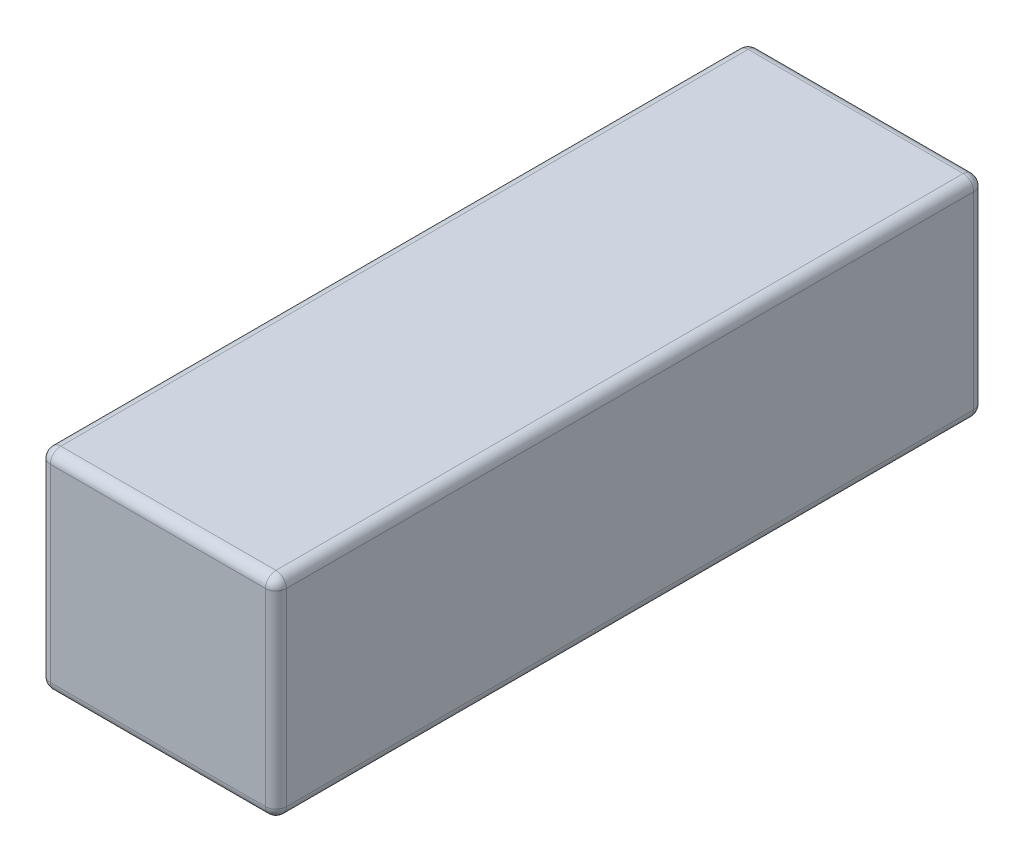
ISO-10303-21;
HEADER;
FILE_DESCRIPTION(('STEP AP214'),'2;1');
FILE_NAME('part.step','',(''),(''),'','','');
FILE_SCHEMA(('AUTOMOTIVE_DESIGN { 1 0 10303 214 1 1 1 1 }'));
ENDSEC;
DATA;
#1=APPLICATION_CONTEXT('core data for automotive mechanical design processes');
#2=APPLICATION_PROTOCOL_DEFINITION('international standard','automotive_design',2000,#1);
#3=PRODUCT_CONTEXT('',#1,'mechanical');
#4=PRODUCT('Part','Part','',(#3));
#5=PRODUCT_RELATED_PRODUCT_CATEGORY('part','',(#4));
#6=PRODUCT_DEFINITION_FORMATION('','',#4);
#7=PRODUCT_DEFINITION_CONTEXT('part definition',#1,'design');
#8=PRODUCT_DEFINITION('design','',#6,#7);
#9=PRODUCT_DEFINITION_SHAPE('','',#8);
#10=(LENGTH_UNIT() NAMED_UNIT(*) SI_UNIT(.MILLI.,.METRE.));
#11=(NAMED_UNIT(*) PLANE_ANGLE_UNIT() SI_UNIT($,.RADIAN.));
#12=(NAMED_UNIT(*) SI_UNIT($,.STERADIAN.) SOLID_ANGLE_UNIT());
#13=UNCERTAINTY_MEASURE_WITH_UNIT(LENGTH_MEASURE(1.E-05),#10,'distance_accuracy_value','');
#14=(GEOMETRIC_REPRESENTATION_CONTEXT(3) GLOBAL_UNCERTAINTY_ASSIGNED_CONTEXT((#13)) GLOBAL_UNIT_ASSIGNED_CONTEXT((#10,
#11,#12)) REPRESENTATION_CONTEXT('',''));
#15=CARTESIAN_POINT('',(0.,0.,0.));
#16=DIRECTION('',(0.,0.,1.));
#17=DIRECTION('',(1.,0.,0.));
#18=AXIS2_PLACEMENT_3D('',#15,#16,#17);
#19=CARTESIAN_POINT('',(22.5,-20.,135.));
#20=DIRECTION('',(-1.,0.,0.));
#21=DIRECTION('',(0.,0.,1.));
#22=AXIS2_PLACEMENT_3D('',#19,#20,#21);
#23=PLANE('',#22);
#24=DIRECTION('',(0.,1.,0.));
#25=VECTOR('',#24,1.);
#26=CARTESIAN_POINT('',(22.5,-20.,133.));
#27=LINE('',#26,#25);
#28=CARTESIAN_POINT('',(22.5,18.,133.));
#29=VERTEX_POINT('',#28);
#30=CARTESIAN_POINT('',(22.5,-18.,133.));
#31=VERTEX_POINT('',#30);
#32=EDGE_CURVE('E46',#29,#31,#27,.F.);
#33=ORIENTED_EDGE('',*,*,#32,.T.);
#34=DIRECTION('',(0.,0.,-1.));
#35=VECTOR('',#34,1.);
#36=CARTESIAN_POINT('',(22.5,-18.,135.));
#37=LINE('',#36,#35);
#38=CARTESIAN_POINT('',(22.5,-18.,2.));
#39=VERTEX_POINT('',#38);
#40=EDGE_CURVE('E11',#31,#39,#37,.T.);
#41=ORIENTED_EDGE('',*,*,#40,.T.);
#42=DIRECTION('',(0.,1.,0.));
#43=VECTOR('',#42,1.);
#44=CARTESIAN_POINT('',(22.5,20.,2.));
#45=LINE('',#44,#43);
#46=CARTESIAN_POINT('',(22.5,18.,2.));
#47=VERTEX_POINT('',#46);
#48=EDGE_CURVE('E231',#39,#47,#45,.T.);
#49=ORIENTED_EDGE('',*,*,#48,.T.);
#50=DIRECTION('',(0.,0.,-1.));
#51=VECTOR('',#50,1.);
#52=CARTESIAN_POINT('',(22.5,18.,135.));
#53=LINE('',#52,#51);
#54=EDGE_CURVE('E57',#47,#29,#53,.F.);
#55=ORIENTED_EDGE('',*,*,#54,.T.);
#56=EDGE_LOOP('',(#33,#41,#49,#55));
#57=FACE_BOUND('',#56,.T.);
#58=ADVANCED_FACE('F37',(#57),#23,.F.);
#59=CARTESIAN_POINT('',(-22.5,20.,135.));
#60=DIRECTION('',(0.,-1.,0.));
#61=DIRECTION('',(0.,0.,-1.));
#62=AXIS2_PLACEMENT_3D('',#59,#60,#61);
#63=PLANE('',#62);
#64=DIRECTION('',(-1.,0.,0.));
#65=VECTOR('',#64,1.);
#66=CARTESIAN_POINT('',(-22.5,20.,2.));
#67=LINE('',#66,#65);
#68=CARTESIAN_POINT('',(20.5,20.,2.));
#69=VERTEX_POINT('',#68);
#70=CARTESIAN_POINT('',(-20.5,20.,2.));
#71=VERTEX_POINT('',#70);
#72=EDGE_CURVE('E278',#69,#71,#67,.T.);
#73=ORIENTED_EDGE('',*,*,#72,.T.);
#74=DIRECTION('',(0.,0.,-1.));
#75=VECTOR('',#74,1.);
#76=CARTESIAN_POINT('',(-20.5,20.,135.));
#77=LINE('',#76,#75);
#78=CARTESIAN_POINT('',(-20.5,20.,133.));
#79=VERTEX_POINT('',#78);
#80=EDGE_CURVE('E280',#71,#79,#77,.F.);
#81=ORIENTED_EDGE('',*,*,#80,.T.);
#82=DIRECTION('',(-1.,0.,0.));
#83=VECTOR('',#82,1.);
#84=CARTESIAN_POINT('',(-22.5,20.,133.));
#85=LINE('',#84,#83);
#86=CARTESIAN_POINT('',(20.5,20.,133.));
#87=VERTEX_POINT('',#86);
#88=EDGE_CURVE('E215',#79,#87,#85,.F.);
#89=ORIENTED_EDGE('',*,*,#88,.T.);
#90=DIRECTION('',(0.,0.,-1.));
#91=VECTOR('',#90,1.);
#92=CARTESIAN_POINT('',(20.5,20.,135.));
#93=LINE('',#92,#91);
#94=EDGE_CURVE('E272',#87,#69,#93,.T.);
#95=ORIENTED_EDGE('',*,*,#94,.T.);
#96=EDGE_LOOP('',(#73,#81,#89,#95));
#97=FACE_BOUND('',#96,.T.);
#98=ADVANCED_FACE('F329',(#97),#63,.F.);
#99=CARTESIAN_POINT('',(-22.5,-20.,135.));
#100=DIRECTION('',(1.,0.,0.));
#101=DIRECTION('',(0.,0.,-1.));
#102=AXIS2_PLACEMENT_3D('',#99,#100,#101);
#103=PLANE('',#102);
#104=DIRECTION('',(0.,0.,-1.));
#105=VECTOR('',#104,1.);
#106=CARTESIAN_POINT('',(-22.5,18.,135.));
#107=LINE('',#106,#105);
#108=CARTESIAN_POINT('',(-22.5,18.,133.));
#109=VERTEX_POINT('',#108);
#110=CARTESIAN_POINT('',(-22.5,18.,2.));
#111=VERTEX_POINT('',#110);
#112=EDGE_CURVE('E261',#109,#111,#107,.T.);
#113=ORIENTED_EDGE('',*,*,#112,.T.);
#114=DIRECTION('',(0.,-1.,0.));
#115=VECTOR('',#114,1.);
#116=CARTESIAN_POINT('',(-22.5,-20.,2.));
#117=LINE('',#116,#115);
#118=CARTESIAN_POINT('',(-22.5,-18.,2.));
#119=VERTEX_POINT('',#118);
#120=EDGE_CURVE('E267',#111,#119,#117,.T.);
#121=ORIENTED_EDGE('',*,*,#120,.T.);
#122=DIRECTION('',(0.,0.,-1.));
#123=VECTOR('',#122,1.);
#124=CARTESIAN_POINT('',(-22.5,-18.,135.));
#125=LINE('',#124,#123);
#126=CARTESIAN_POINT('',(-22.5,-18.,133.));
#127=VERTEX_POINT('',#126);
#128=EDGE_CURVE('E264',#119,#127,#125,.F.);
#129=ORIENTED_EDGE('',*,*,#128,.T.);
#130=DIRECTION('',(0.,-1.,0.));
#131=VECTOR('',#130,1.);
#132=CARTESIAN_POINT('',(-22.5,-20.,133.));
#133=LINE('',#132,#131);
#134=EDGE_CURVE('E256',#127,#109,#133,.F.);
#135=ORIENTED_EDGE('',*,*,#134,.T.);
#136=EDGE_LOOP('',(#113,#121,#129,#135));
#137=FACE_BOUND('',#136,.T.);
#138=ADVANCED_FACE('F265',(#137),#103,.F.);
#139=CARTESIAN_POINT('',(-22.5,-20.,135.));
#140=DIRECTION('',(0.,1.,0.));
#141=DIRECTION('',(0.,0.,1.));
#142=AXIS2_PLACEMENT_3D('',#139,#140,#141);
#143=PLANE('',#142);
#144=DIRECTION('',(1.,0.,0.));
#145=VECTOR('',#144,1.);
#146=CARTESIAN_POINT('',(-22.5,-20.,133.));
#147=LINE('',#146,#145);
#148=CARTESIAN_POINT('',(20.5,-20.,133.));
#149=VERTEX_POINT('',#148);
#150=CARTESIAN_POINT('',(-20.5,-20.,133.));
#151=VERTEX_POINT('',#150);
#152=EDGE_CURVE('E136',#149,#151,#147,.F.);
#153=ORIENTED_EDGE('',*,*,#152,.T.);
#154=DIRECTION('',(0.,0.,-1.));
#155=VECTOR('',#154,1.);
#156=CARTESIAN_POINT('',(-20.5,-20.,135.));
#157=LINE('',#156,#155);
#158=CARTESIAN_POINT('',(-20.5,-20.,2.));
#159=VERTEX_POINT('',#158);
#160=EDGE_CURVE('E132',#151,#159,#157,.T.);
#161=ORIENTED_EDGE('',*,*,#160,.T.);
#162=DIRECTION('',(1.,0.,0.));
#163=VECTOR('',#162,1.);
#164=CARTESIAN_POINT('',(22.5,-20.,2.));
#165=LINE('',#164,#163);
#166=CARTESIAN_POINT('',(20.5,-20.,2.));
#167=VERTEX_POINT('',#166);
#168=EDGE_CURVE('E126',#159,#167,#165,.T.);
#169=ORIENTED_EDGE('',*,*,#168,.T.);
#170=DIRECTION('',(0.,0.,-1.));
#171=VECTOR('',#170,1.);
#172=CARTESIAN_POINT('',(20.5,-20.,135.));
#173=LINE('',#172,#171);
#174=EDGE_CURVE('E129',#167,#149,#173,.F.);
#175=ORIENTED_EDGE('',*,*,#174,.T.);
#176=EDGE_LOOP('',(#153,#161,#169,#175));
#177=FACE_BOUND('',#176,.T.);
#178=ADVANCED_FACE('F128',(#177),#143,.F.);
#179=CARTESIAN_POINT('',(0.,0.,135.));
#180=DIRECTION('',(0.,0.,-1.));
#181=DIRECTION('',(-1.,0.,0.));
#182=AXIS2_PLACEMENT_3D('',#179,#180,#181);
#183=PLANE('',#182);
#184=DIRECTION('',(0.,-1.,0.));
#185=VECTOR('',#184,1.);
#186=CARTESIAN_POINT('',(-20.5,0.,135.));
#187=LINE('',#186,#185);
#188=CARTESIAN_POINT('',(-20.5,18.,135.));
#189=VERTEX_POINT('',#188);
#190=CARTESIAN_POINT('',(-20.5,-18.,135.));
#191=VERTEX_POINT('',#190);
#192=EDGE_CURVE('E220',#189,#191,#187,.T.);
#193=ORIENTED_EDGE('',*,*,#192,.T.);
#194=DIRECTION('',(1.,0.,0.));
#195=VECTOR('',#194,1.);
#196=CARTESIAN_POINT('',(0.,-18.,135.));
#197=LINE('',#196,#195);
#198=CARTESIAN_POINT('',(20.5,-18.,135.));
#199=VERTEX_POINT('',#198);
#200=EDGE_CURVE('E223',#191,#199,#197,.T.);
#201=ORIENTED_EDGE('',*,*,#200,.T.);
#202=DIRECTION('',(0.,1.,0.));
#203=VECTOR('',#202,1.);
#204=CARTESIAN_POINT('',(20.5,0.,135.));
#205=LINE('',#204,#203);
#206=CARTESIAN_POINT('',(20.5,18.,135.));
#207=VERTEX_POINT('',#206);
#208=EDGE_CURVE('E221',#199,#207,#205,.T.);
#209=ORIENTED_EDGE('',*,*,#208,.T.);
#210=DIRECTION('',(-1.,0.,0.));
#211=VECTOR('',#210,1.);
#212=CARTESIAN_POINT('',(0.,18.,135.));
#213=LINE('',#212,#211);
#214=EDGE_CURVE('E217',#207,#189,#213,.T.);
#215=ORIENTED_EDGE('',*,*,#214,.T.);
#216=EDGE_LOOP('',(#193,#201,#209,#215));
#217=FACE_BOUND('',#216,.T.);
#218=ADVANCED_FACE('F310',(#217),#183,.F.);
#219=CARTESIAN_POINT('',(0.,0.,0.));
#220=DIRECTION('',(0.,0.,-1.));
#221=DIRECTION('',(-1.,0.,0.));
#222=AXIS2_PLACEMENT_3D('',#219,#220,#221);
#223=PLANE('',#222);
#224=DIRECTION('',(0.,-1.,0.));
#225=VECTOR('',#224,1.);
#226=CARTESIAN_POINT('',(-20.5,20.,0.));
#227=LINE('',#226,#225);
#228=CARTESIAN_POINT('',(-20.5,-18.,0.));
#229=VERTEX_POINT('',#228);
#230=CARTESIAN_POINT('',(-20.5,18.,0.));
#231=VERTEX_POINT('',#230);
#232=EDGE_CURVE('E285',#229,#231,#227,.F.);
#233=ORIENTED_EDGE('',*,*,#232,.T.);
#234=DIRECTION('',(-1.,0.,0.));
#235=VECTOR('',#234,1.);
#236=CARTESIAN_POINT('',(22.5,18.,0.));
#237=LINE('',#236,#235);
#238=CARTESIAN_POINT('',(20.5,18.,0.));
#239=VERTEX_POINT('',#238);
#240=EDGE_CURVE('E225',#231,#239,#237,.F.);
#241=ORIENTED_EDGE('',*,*,#240,.T.);
#242=DIRECTION('',(0.,1.,0.));
#243=VECTOR('',#242,1.);
#244=CARTESIAN_POINT('',(20.5,-20.,0.));
#245=LINE('',#244,#243);
#246=CARTESIAN_POINT('',(20.5,-18.,0.));
#247=VERTEX_POINT('',#246);
#248=EDGE_CURVE('E282',#239,#247,#245,.F.);
#249=ORIENTED_EDGE('',*,*,#248,.T.);
#250=DIRECTION('',(1.,0.,0.));
#251=VECTOR('',#250,1.);
#252=CARTESIAN_POINT('',(-22.5,-18.,0.));
#253=LINE('',#252,#251);
#254=EDGE_CURVE('E157',#247,#229,#253,.F.);
#255=ORIENTED_EDGE('',*,*,#254,.T.);
#256=EDGE_LOOP('',(#233,#241,#249,#255));
#257=FACE_BOUND('',#256,.T.);
#258=ADVANCED_FACE('F289',(#257),#223,.T.);
#259=CARTESIAN_POINT('',(20.5,18.,135.));
#260=DIRECTION('',(0.,0.,-1.));
#261=DIRECTION('',(-1.,0.,0.));
#262=AXIS2_PLACEMENT_3D('',#259,#260,#261);
#263=CYLINDRICAL_SURFACE('',#262,2.);
#264=CARTESIAN_POINT('',(20.5,18.,133.));
#265=DIRECTION('',(0.,0.,1.));
#266=DIRECTION('',(1.,0.,0.));
#267=AXIS2_PLACEMENT_3D('',#264,#265,#266);
#268=CIRCLE('',#267,2.);
#269=EDGE_CURVE('E41',#29,#87,#268,.T.);
#270=ORIENTED_EDGE('',*,*,#269,.F.);
#271=ORIENTED_EDGE('',*,*,#54,.F.);
#272=CARTESIAN_POINT('',(20.5,18.,2.));
#273=DIRECTION('',(0.,0.,-1.));
#274=DIRECTION('',(-1.,0.,0.));
#275=AXIS2_PLACEMENT_3D('',#272,#273,#274);
#276=CIRCLE('',#275,2.);
#277=EDGE_CURVE('E197',#69,#47,#276,.T.);
#278=ORIENTED_EDGE('',*,*,#277,.F.);
#279=ORIENTED_EDGE('',*,*,#94,.F.);
#280=EDGE_LOOP('',(#270,#271,#278,#279));
#281=FACE_BOUND('',#280,.T.);
#282=ADVANCED_FACE('F39',(#281),#263,.T.);
#283=CARTESIAN_POINT('',(20.5,18.,133.));
#284=DIRECTION('',(0.,0.,1.));
#285=DIRECTION('',(1.,0.,0.));
#286=AXIS2_PLACEMENT_3D('',#283,#284,#285);
#287=SPHERICAL_SURFACE('',#286,2.);
#288=CARTESIAN_POINT('',(20.5,18.,133.));
#289=DIRECTION('',(0.,1.,0.));
#290=DIRECTION('',(0.,0.,1.));
#291=AXIS2_PLACEMENT_3D('',#288,#289,#290);
#292=CIRCLE('',#291,2.);
#293=EDGE_CURVE('E192',#29,#207,#292,.F.);
#294=ORIENTED_EDGE('',*,*,#293,.F.);
#295=ORIENTED_EDGE('',*,*,#269,.T.);
#296=CARTESIAN_POINT('',(20.5,18.,133.));
#297=DIRECTION('',(1.,0.,0.));
#298=DIRECTION('',(0.,0.,-1.));
#299=AXIS2_PLACEMENT_3D('',#296,#297,#298);
#300=CIRCLE('',#299,2.);
#301=EDGE_CURVE('E195',#207,#87,#300,.F.);
#302=ORIENTED_EDGE('',*,*,#301,.F.);
#303=EDGE_LOOP('',(#294,#295,#302));
#304=FACE_BOUND('',#303,.T.);
#305=ADVANCED_FACE('F207',(#304),#287,.T.);
#306=CARTESIAN_POINT('',(20.5,18.,2.));
#307=DIRECTION('',(0.,0.,1.));
#308=DIRECTION('',(1.,0.,0.));
#309=AXIS2_PLACEMENT_3D('',#306,#307,#308);
#310=SPHERICAL_SURFACE('',#309,2.);
#311=CARTESIAN_POINT('',(20.5,18.,2.));
#312=DIRECTION('',(1.,0.,0.));
#313=DIRECTION('',(0.,0.,-1.));
#314=AXIS2_PLACEMENT_3D('',#311,#312,#313);
#315=CIRCLE('',#314,2.);
#316=EDGE_CURVE('E186',#69,#239,#315,.F.);
#317=ORIENTED_EDGE('',*,*,#316,.F.);
#318=ORIENTED_EDGE('',*,*,#277,.T.);
#319=CARTESIAN_POINT('',(20.5,18.,2.));
#320=DIRECTION('',(0.,1.,0.));
#321=DIRECTION('',(0.,0.,1.));
#322=AXIS2_PLACEMENT_3D('',#319,#320,#321);
#323=CIRCLE('',#322,2.);
#324=EDGE_CURVE('E189',#239,#47,#323,.F.);
#325=ORIENTED_EDGE('',*,*,#324,.F.);
#326=EDGE_LOOP('',(#317,#318,#325));
#327=FACE_BOUND('',#326,.T.);
#328=ADVANCED_FACE('F460',(#327),#310,.T.);
#329=CARTESIAN_POINT('',(0.,18.,133.));
#330=DIRECTION('',(-1.,0.,0.));
#331=DIRECTION('',(0.,0.,1.));
#332=AXIS2_PLACEMENT_3D('',#329,#330,#331);
#333=CYLINDRICAL_SURFACE('',#332,2.);
#334=ORIENTED_EDGE('',*,*,#301,.T.);
#335=ORIENTED_EDGE('',*,*,#88,.F.);
#336=CARTESIAN_POINT('',(-20.5,18.,133.));
#337=DIRECTION('',(-1.,0.,0.));
#338=DIRECTION('',(0.,0.,1.));
#339=AXIS2_PLACEMENT_3D('',#336,#337,#338);
#340=CIRCLE('',#339,2.);
#341=EDGE_CURVE('E181',#189,#79,#340,.T.);
#342=ORIENTED_EDGE('',*,*,#341,.F.);
#343=ORIENTED_EDGE('',*,*,#214,.F.);
#344=EDGE_LOOP('',(#334,#335,#342,#343));
#345=FACE_BOUND('',#344,.T.);
#346=ADVANCED_FACE('F213',(#345),#333,.T.);
#347=CARTESIAN_POINT('',(20.5,0.,133.));
#348=DIRECTION('',(0.,1.,0.));
#349=DIRECTION('',(0.,0.,1.));
#350=AXIS2_PLACEMENT_3D('',#347,#348,#349);
#351=CYLINDRICAL_SURFACE('',#350,2.);
#352=ORIENTED_EDGE('',*,*,#293,.T.);
#353=ORIENTED_EDGE('',*,*,#208,.F.);
#354=CARTESIAN_POINT('',(20.5,-18.,133.));
#355=DIRECTION('',(0.,-1.,0.));
#356=DIRECTION('',(0.,0.,-1.));
#357=AXIS2_PLACEMENT_3D('',#354,#355,#356);
#358=CIRCLE('',#357,2.);
#359=EDGE_CURVE('E178',#31,#199,#358,.T.);
#360=ORIENTED_EDGE('',*,*,#359,.F.);
#361=ORIENTED_EDGE('',*,*,#32,.F.);
#362=EDGE_LOOP('',(#352,#353,#360,#361));
#363=FACE_BOUND('',#362,.T.);
#364=ADVANCED_FACE('F314',(#363),#351,.T.);
#365=CARTESIAN_POINT('',(20.5,-18.,135.));
#366=DIRECTION('',(0.,0.,-1.));
#367=DIRECTION('',(-1.,0.,0.));
#368=AXIS2_PLACEMENT_3D('',#365,#366,#367);
#369=CYLINDRICAL_SURFACE('',#368,2.);
#370=CARTESIAN_POINT('',(20.5,-18.,2.));
#371=DIRECTION('',(0.,0.,-1.));
#372=DIRECTION('',(-1.,0.,0.));
#373=AXIS2_PLACEMENT_3D('',#370,#371,#372);
#374=CIRCLE('',#373,2.);
#375=EDGE_CURVE('E142',#39,#167,#374,.T.);
#376=ORIENTED_EDGE('',*,*,#375,.F.);
#377=ORIENTED_EDGE('',*,*,#40,.F.);
#378=CARTESIAN_POINT('',(20.5,-18.,133.));
#379=DIRECTION('',(0.,0.,1.));
#380=DIRECTION('',(1.,0.,0.));
#381=AXIS2_PLACEMENT_3D('',#378,#379,#380);
#382=CIRCLE('',#381,2.);
#383=EDGE_CURVE('E145',#149,#31,#382,.T.);
#384=ORIENTED_EDGE('',*,*,#383,.F.);
#385=ORIENTED_EDGE('',*,*,#174,.F.);
#386=EDGE_LOOP('',(#376,#377,#384,#385));
#387=FACE_BOUND('',#386,.T.);
#388=ADVANCED_FACE('F141',(#387),#369,.T.);
#389=CARTESIAN_POINT('',(20.5,-20.,2.));
#390=DIRECTION('',(0.,-1.,0.));
#391=DIRECTION('',(0.,0.,-1.));
#392=AXIS2_PLACEMENT_3D('',#389,#390,#391);
#393=CYLINDRICAL_SURFACE('',#392,2.);
#394=ORIENTED_EDGE('',*,*,#324,.T.);
#395=ORIENTED_EDGE('',*,*,#48,.F.);
#396=CARTESIAN_POINT('',(20.5,-18.,2.));
#397=DIRECTION('',(0.,-1.,0.));
#398=DIRECTION('',(0.,0.,-1.));
#399=AXIS2_PLACEMENT_3D('',#396,#397,#398);
#400=CIRCLE('',#399,2.);
#401=EDGE_CURVE('E154',#247,#39,#400,.T.);
#402=ORIENTED_EDGE('',*,*,#401,.F.);
#403=ORIENTED_EDGE('',*,*,#248,.F.);
#404=EDGE_LOOP('',(#394,#395,#402,#403));
#405=FACE_BOUND('',#404,.T.);
#406=ADVANCED_FACE('F430',(#405),#393,.T.);
#407=CARTESIAN_POINT('',(-22.5,18.,2.));
#408=DIRECTION('',(1.,0.,0.));
#409=DIRECTION('',(0.,0.,-1.));
#410=AXIS2_PLACEMENT_3D('',#407,#408,#409);
#411=CYLINDRICAL_SURFACE('',#410,2.);
#412=ORIENTED_EDGE('',*,*,#316,.T.);
#413=ORIENTED_EDGE('',*,*,#240,.F.);
#414=CARTESIAN_POINT('',(-20.5,18.,2.));
#415=DIRECTION('',(-1.,0.,0.));
#416=DIRECTION('',(0.,0.,1.));
#417=AXIS2_PLACEMENT_3D('',#414,#415,#416);
#418=CIRCLE('',#417,2.);
#419=EDGE_CURVE('E173',#71,#231,#418,.T.);
#420=ORIENTED_EDGE('',*,*,#419,.F.);
#421=ORIENTED_EDGE('',*,*,#72,.F.);
#422=EDGE_LOOP('',(#412,#413,#420,#421));
#423=FACE_BOUND('',#422,.T.);
#424=ADVANCED_FACE('F293',(#423),#411,.T.);
#425=CARTESIAN_POINT('',(-20.5,18.,135.));
#426=DIRECTION('',(0.,0.,-1.));
#427=DIRECTION('',(-1.,0.,0.));
#428=AXIS2_PLACEMENT_3D('',#425,#426,#427);
#429=CYLINDRICAL_SURFACE('',#428,2.);
#430=CARTESIAN_POINT('',(-20.5,18.,133.));
#431=DIRECTION('',(0.,0.,1.));
#432=DIRECTION('',(1.,0.,0.));
#433=AXIS2_PLACEMENT_3D('',#430,#431,#432);
#434=CIRCLE('',#433,2.);
#435=EDGE_CURVE('E183',#79,#109,#434,.T.);
#436=ORIENTED_EDGE('',*,*,#435,.F.);
#437=ORIENTED_EDGE('',*,*,#80,.F.);
#438=CARTESIAN_POINT('',(-20.5,18.,2.));
#439=DIRECTION('',(0.,0.,-1.));
#440=DIRECTION('',(-1.,0.,0.));
#441=AXIS2_PLACEMENT_3D('',#438,#439,#440);
#442=CIRCLE('',#441,2.);
#443=EDGE_CURVE('E170',#111,#71,#442,.T.);
#444=ORIENTED_EDGE('',*,*,#443,.F.);
#445=ORIENTED_EDGE('',*,*,#112,.F.);
#446=EDGE_LOOP('',(#436,#437,#444,#445));
#447=FACE_BOUND('',#446,.T.);
#448=ADVANCED_FACE('F325',(#447),#429,.T.);
#449=CARTESIAN_POINT('',(-20.5,18.,133.));
#450=DIRECTION('',(0.,0.,1.));
#451=DIRECTION('',(1.,0.,0.));
#452=AXIS2_PLACEMENT_3D('',#449,#450,#451);
#453=SPHERICAL_SURFACE('',#452,2.);
#454=ORIENTED_EDGE('',*,*,#341,.T.);
#455=ORIENTED_EDGE('',*,*,#435,.T.);
#456=CARTESIAN_POINT('',(-20.5,18.,133.));
#457=DIRECTION('',(0.,1.,0.));
#458=DIRECTION('',(0.,0.,1.));
#459=AXIS2_PLACEMENT_3D('',#456,#457,#458);
#460=CIRCLE('',#459,2.);
#461=EDGE_CURVE('E161',#189,#109,#460,.F.);
#462=ORIENTED_EDGE('',*,*,#461,.F.);
#463=EDGE_LOOP('',(#454,#455,#462));
#464=FACE_BOUND('',#463,.T.);
#465=ADVANCED_FACE('F318',(#464),#453,.T.);
#466=CARTESIAN_POINT('',(20.5,-18.,133.));
#467=DIRECTION('',(0.,0.,1.));
#468=DIRECTION('',(1.,0.,0.));
#469=AXIS2_PLACEMENT_3D('',#466,#467,#468);
#470=SPHERICAL_SURFACE('',#469,2.);
#471=ORIENTED_EDGE('',*,*,#383,.T.);
#472=ORIENTED_EDGE('',*,*,#359,.T.);
#473=CARTESIAN_POINT('',(20.5,-18.,133.));
#474=DIRECTION('',(1.,0.,0.));
#475=DIRECTION('',(0.,0.,-1.));
#476=AXIS2_PLACEMENT_3D('',#473,#474,#475);
#477=CIRCLE('',#476,2.);
#478=EDGE_CURVE('E158',#149,#199,#477,.F.);
#479=ORIENTED_EDGE('',*,*,#478,.F.);
#480=EDGE_LOOP('',(#471,#472,#479));
#481=FACE_BOUND('',#480,.T.);
#482=ADVANCED_FACE('F316',(#481),#470,.T.);
#483=CARTESIAN_POINT('',(20.5,-18.,2.));
#484=DIRECTION('',(0.,0.,1.));
#485=DIRECTION('',(1.,0.,0.));
#486=AXIS2_PLACEMENT_3D('',#483,#484,#485);
#487=SPHERICAL_SURFACE('',#486,2.);
#488=ORIENTED_EDGE('',*,*,#401,.T.);
#489=ORIENTED_EDGE('',*,*,#375,.T.);
#490=CARTESIAN_POINT('',(20.5,-18.,2.));
#491=DIRECTION('',(1.,0.,0.));
#492=DIRECTION('',(0.,0.,-1.));
#493=AXIS2_PLACEMENT_3D('',#490,#491,#492);
#494=CIRCLE('',#493,2.);
#495=EDGE_CURVE('E151',#247,#167,#494,.F.);
#496=ORIENTED_EDGE('',*,*,#495,.F.);
#497=EDGE_LOOP('',(#488,#489,#496));
#498=FACE_BOUND('',#497,.T.);
#499=ADVANCED_FACE('F150',(#498),#487,.T.);
#500=CARTESIAN_POINT('',(-20.5,18.,2.));
#501=DIRECTION('',(0.,0.,1.));
#502=DIRECTION('',(1.,0.,0.));
#503=AXIS2_PLACEMENT_3D('',#500,#501,#502);
#504=SPHERICAL_SURFACE('',#503,2.);
#505=ORIENTED_EDGE('',*,*,#443,.T.);
#506=ORIENTED_EDGE('',*,*,#419,.T.);
#507=CARTESIAN_POINT('',(-20.5,18.,2.));
#508=DIRECTION('',(0.,1.,0.));
#509=DIRECTION('',(-1.,0.,0.));
#510=AXIS2_PLACEMENT_3D('',#507,#508,#509);
#511=CIRCLE('',#510,2.);
#512=EDGE_CURVE('E159',#111,#231,#511,.F.);
#513=ORIENTED_EDGE('',*,*,#512,.F.);
#514=EDGE_LOOP('',(#505,#506,#513));
#515=FACE_BOUND('',#514,.T.);
#516=ADVANCED_FACE('F297',(#515),#504,.T.);
#517=CARTESIAN_POINT('',(-20.5,0.,133.));
#518=DIRECTION('',(0.,-1.,0.));
#519=DIRECTION('',(0.,0.,-1.));
#520=AXIS2_PLACEMENT_3D('',#517,#518,#519);
#521=CYLINDRICAL_SURFACE('',#520,2.);
#522=ORIENTED_EDGE('',*,*,#461,.T.);
#523=ORIENTED_EDGE('',*,*,#134,.F.);
#524=CARTESIAN_POINT('',(-20.5,-18.,133.));
#525=DIRECTION('',(0.,-1.,0.));
#526=DIRECTION('',(0.,0.,-1.));
#527=AXIS2_PLACEMENT_3D('',#524,#525,#526);
#528=CIRCLE('',#527,2.);
#529=EDGE_CURVE('E164',#191,#127,#528,.T.);
#530=ORIENTED_EDGE('',*,*,#529,.F.);
#531=ORIENTED_EDGE('',*,*,#192,.F.);
#532=EDGE_LOOP('',(#522,#523,#530,#531));
#533=FACE_BOUND('',#532,.T.);
#534=ADVANCED_FACE('F258',(#533),#521,.T.);
#535=CARTESIAN_POINT('',(0.,-18.,133.));
#536=DIRECTION('',(1.,0.,0.));
#537=DIRECTION('',(0.,0.,-1.));
#538=AXIS2_PLACEMENT_3D('',#535,#536,#537);
#539=CYLINDRICAL_SURFACE('',#538,2.);
#540=ORIENTED_EDGE('',*,*,#478,.T.);
#541=ORIENTED_EDGE('',*,*,#200,.F.);
#542=CARTESIAN_POINT('',(-20.5,-18.,133.));
#543=DIRECTION('',(-1.,0.,0.));
#544=DIRECTION('',(0.,0.,1.));
#545=AXIS2_PLACEMENT_3D('',#542,#543,#544);
#546=CIRCLE('',#545,2.);
#547=EDGE_CURVE('E245',#151,#191,#546,.T.);
#548=ORIENTED_EDGE('',*,*,#547,.F.);
#549=ORIENTED_EDGE('',*,*,#152,.F.);
#550=EDGE_LOOP('',(#540,#541,#548,#549));
#551=FACE_BOUND('',#550,.T.);
#552=ADVANCED_FACE('F309',(#551),#539,.T.);
#553=CARTESIAN_POINT('',(-22.5,-18.,2.));
#554=DIRECTION('',(-1.,0.,0.));
#555=DIRECTION('',(0.,0.,1.));
#556=AXIS2_PLACEMENT_3D('',#553,#554,#555);
#557=CYLINDRICAL_SURFACE('',#556,2.);
#558=ORIENTED_EDGE('',*,*,#495,.T.);
#559=ORIENTED_EDGE('',*,*,#168,.F.);
#560=CARTESIAN_POINT('',(-20.5,-18.,2.));
#561=DIRECTION('',(-1.,0.,0.));
#562=DIRECTION('',(0.,0.,1.));
#563=AXIS2_PLACEMENT_3D('',#560,#561,#562);
#564=CIRCLE('',#563,2.);
#565=EDGE_CURVE('E242',#229,#159,#564,.T.);
#566=ORIENTED_EDGE('',*,*,#565,.F.);
#567=ORIENTED_EDGE('',*,*,#254,.F.);
#568=EDGE_LOOP('',(#558,#559,#566,#567));
#569=FACE_BOUND('',#568,.T.);
#570=ADVANCED_FACE('F156',(#569),#557,.T.);
#571=CARTESIAN_POINT('',(-20.5,-20.,2.));
#572=DIRECTION('',(0.,1.,0.));
#573=DIRECTION('',(0.,0.,1.));
#574=AXIS2_PLACEMENT_3D('',#571,#572,#573);
#575=CYLINDRICAL_SURFACE('',#574,2.);
#576=ORIENTED_EDGE('',*,*,#512,.T.);
#577=ORIENTED_EDGE('',*,*,#232,.F.);
#578=CARTESIAN_POINT('',(-20.5,-18.,2.));
#579=DIRECTION('',(0.,-1.,0.));
#580=DIRECTION('',(0.,0.,-1.));
#581=AXIS2_PLACEMENT_3D('',#578,#579,#580);
#582=CIRCLE('',#581,2.);
#583=EDGE_CURVE('E239',#119,#229,#582,.T.);
#584=ORIENTED_EDGE('',*,*,#583,.F.);
#585=ORIENTED_EDGE('',*,*,#120,.F.);
#586=EDGE_LOOP('',(#576,#577,#584,#585));
#587=FACE_BOUND('',#586,.T.);
#588=ADVANCED_FACE('F300',(#587),#575,.T.);
#589=CARTESIAN_POINT('',(-20.5,-18.,133.));
#590=DIRECTION('',(0.,0.,1.));
#591=DIRECTION('',(1.,0.,0.));
#592=AXIS2_PLACEMENT_3D('',#589,#590,#591);
#593=SPHERICAL_SURFACE('',#592,2.);
#594=ORIENTED_EDGE('',*,*,#547,.T.);
#595=ORIENTED_EDGE('',*,*,#529,.T.);
#596=CARTESIAN_POINT('',(-20.5,-18.,133.));
#597=DIRECTION('',(0.,0.,1.));
#598=DIRECTION('',(1.,0.,0.));
#599=AXIS2_PLACEMENT_3D('',#596,#597,#598);
#600=CIRCLE('',#599,2.);
#601=EDGE_CURVE('E237',#151,#127,#600,.F.);
#602=ORIENTED_EDGE('',*,*,#601,.F.);
#603=EDGE_LOOP('',(#594,#595,#602));
#604=FACE_BOUND('',#603,.T.);
#605=ADVANCED_FACE('F252',(#604),#593,.T.);
#606=CARTESIAN_POINT('',(-20.5,-18.,2.));
#607=DIRECTION('',(0.,0.,1.));
#608=DIRECTION('',(1.,0.,0.));
#609=AXIS2_PLACEMENT_3D('',#606,#607,#608);
#610=SPHERICAL_SURFACE('',#609,2.);
#611=ORIENTED_EDGE('',*,*,#583,.T.);
#612=ORIENTED_EDGE('',*,*,#565,.T.);
#613=CARTESIAN_POINT('',(-20.5,-18.,2.));
#614=DIRECTION('',(0.,0.,-1.));
#615=DIRECTION('',(-1.,0.,0.));
#616=AXIS2_PLACEMENT_3D('',#613,#614,#615);
#617=CIRCLE('',#616,2.);
#618=EDGE_CURVE('E235',#119,#159,#617,.F.);
#619=ORIENTED_EDGE('',*,*,#618,.F.);
#620=EDGE_LOOP('',(#611,#612,#619));
#621=FACE_BOUND('',#620,.T.);
#622=ADVANCED_FACE('F302',(#621),#610,.T.);
#623=CARTESIAN_POINT('',(-20.5,-18.,135.));
#624=DIRECTION('',(0.,0.,-1.));
#625=DIRECTION('',(-1.,0.,0.));
#626=AXIS2_PLACEMENT_3D('',#623,#624,#625);
#627=CYLINDRICAL_SURFACE('',#626,2.);
#628=ORIENTED_EDGE('',*,*,#601,.T.);
#629=ORIENTED_EDGE('',*,*,#128,.F.);
#630=ORIENTED_EDGE('',*,*,#618,.T.);
#631=ORIENTED_EDGE('',*,*,#160,.F.);
#632=EDGE_LOOP('',(#628,#629,#630,#631));
#633=FACE_BOUND('',#632,.T.);
#634=ADVANCED_FACE('F303',(#633),#627,.T.);
#635=CLOSED_SHELL('',(#58,#98,#138,#178,#218,#258,#282,#305,#328,#346,#364,#388,#406,#424,#448,
#465,#482,#499,#516,#534,#552,#570,#588,#605,#622,#634));
#636=MANIFOLD_SOLID_BREP('B2',#635);
#637=ADVANCED_BREP_SHAPE_REPRESENTATION('',(#18,#636),#14);
#638=SHAPE_DEFINITION_REPRESENTATION(#9,#637);
ENDSEC;
END-ISO-10303-21;
